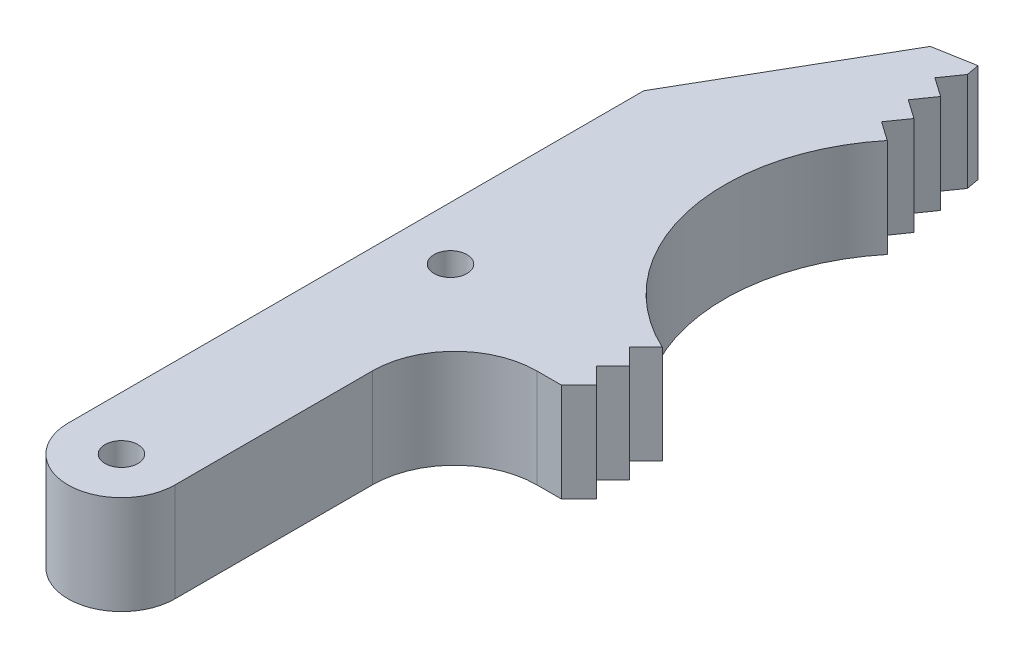
ISO-10303-21;
HEADER;
FILE_DESCRIPTION(('STEP AP214'),'2;1');
FILE_NAME('part.step','',(''),(''),'','','');
FILE_SCHEMA(('AUTOMOTIVE_DESIGN { 1 0 10303 214 1 1 1 1 }'));
ENDSEC;
DATA;
#1=APPLICATION_CONTEXT('core data for automotive mechanical design processes');
#2=APPLICATION_PROTOCOL_DEFINITION('international standard','automotive_design',2000,#1);
#3=PRODUCT_CONTEXT('',#1,'mechanical');
#4=PRODUCT('Part','Part','',(#3));
#5=PRODUCT_RELATED_PRODUCT_CATEGORY('part','',(#4));
#6=PRODUCT_DEFINITION_FORMATION('','',#4);
#7=PRODUCT_DEFINITION_CONTEXT('part definition',#1,'design');
#8=PRODUCT_DEFINITION('design','',#6,#7);
#9=PRODUCT_DEFINITION_SHAPE('','',#8);
#10=(LENGTH_UNIT() NAMED_UNIT(*) SI_UNIT(.MILLI.,.METRE.));
#11=(NAMED_UNIT(*) PLANE_ANGLE_UNIT() SI_UNIT($,.RADIAN.));
#12=(NAMED_UNIT(*) SI_UNIT($,.STERADIAN.) SOLID_ANGLE_UNIT());
#13=UNCERTAINTY_MEASURE_WITH_UNIT(LENGTH_MEASURE(1.E-05),#10,'distance_accuracy_value','');
#14=(GEOMETRIC_REPRESENTATION_CONTEXT(3) GLOBAL_UNCERTAINTY_ASSIGNED_CONTEXT((#13)) GLOBAL_UNIT_ASSIGNED_CONTEXT((#10,
#11,#12)) REPRESENTATION_CONTEXT('',''));
#15=CARTESIAN_POINT('',(0.,0.,0.));
#16=DIRECTION('',(0.,0.,1.));
#17=DIRECTION('',(1.,0.,0.));
#18=AXIS2_PLACEMENT_3D('',#15,#16,#17);
#19=CARTESIAN_POINT('',(0.,12.,0.));
#20=DIRECTION('',(0.,1.,0.));
#21=DIRECTION('',(0.,0.,1.));
#22=AXIS2_PLACEMENT_3D('',#19,#20,#21);
#23=PLANE('',#22);
#24=CARTESIAN_POINT('',(0.,12.,-40.));
#25=DIRECTION('',(0.,1.,0.));
#26=DIRECTION('',(0.,0.,1.));
#27=AXIS2_PLACEMENT_3D('',#24,#25,#26);
#28=CIRCLE('',#27,2.);
#29=CARTESIAN_POINT('',(0.,12.,-38.));
#30=VERTEX_POINT('',#29);
#31=EDGE_CURVE('E380',#30,#30,#28,.T.);
#32=ORIENTED_EDGE('',*,*,#31,.F.);
#33=EDGE_LOOP('',(#32));
#34=FACE_BOUND('',#33,.T.);
#35=DIRECTION('',(-0.500000000000001,0.,0.866025403784438));
#36=VECTOR('',#35,1.);
#37=CARTESIAN_POINT('',(6.25000000000002,12.,-92.0836477965032));
#38=LINE('',#37,#36);
#39=CARTESIAN_POINT('',(6.25000000000002,12.,-92.0836477965032));
#40=VERTEX_POINT('',#39);
#41=CARTESIAN_POINT('',(-6.50000000000001,12.,-70.));
#42=VERTEX_POINT('',#41);
#43=EDGE_CURVE('E241',#40,#42,#38,.T.);
#44=ORIENTED_EDGE('',*,*,#43,.T.);
#45=DIRECTION('',(0.,0.,1.));
#46=VECTOR('',#45,1.);
#47=CARTESIAN_POINT('',(-6.50000000000001,12.,-70.));
#48=LINE('',#47,#46);
#49=CARTESIAN_POINT('',(-6.50000000000001,12.,0.));
#50=VERTEX_POINT('',#49);
#51=EDGE_CURVE('E129',#42,#50,#48,.T.);
#52=ORIENTED_EDGE('',*,*,#51,.T.);
#53=CARTESIAN_POINT('',(0.,12.,0.));
#54=DIRECTION('',(0.,1.,0.));
#55=DIRECTION('',(0.,0.,1.));
#56=AXIS2_PLACEMENT_3D('',#53,#54,#55);
#57=CIRCLE('',#56,6.50000000000001);
#58=CARTESIAN_POINT('',(6.50000000000001,12.,0.));
#59=VERTEX_POINT('',#58);
#60=EDGE_CURVE('E292',#50,#59,#57,.T.);
#61=ORIENTED_EDGE('',*,*,#60,.T.);
#62=DIRECTION('',(0.,0.,-1.));
#63=VECTOR('',#62,1.);
#64=CARTESIAN_POINT('',(6.50000000000001,12.,0.));
#65=LINE('',#64,#63);
#66=CARTESIAN_POINT('',(6.50000000000001,12.,-24.));
#67=VERTEX_POINT('',#66);
#68=EDGE_CURVE('E311',#59,#67,#65,.T.);
#69=ORIENTED_EDGE('',*,*,#68,.T.);
#70=CARTESIAN_POINT('',(16.5,12.,-24.));
#71=DIRECTION('',(0.,-1.,0.));
#72=DIRECTION('',(0.,0.,1.));
#73=AXIS2_PLACEMENT_3D('',#70,#71,#72);
#74=CIRCLE('',#73,10.);
#75=CARTESIAN_POINT('',(16.5,12.,-34.));
#76=VERTEX_POINT('',#75);
#77=EDGE_CURVE('E308',#67,#76,#74,.T.);
#78=ORIENTED_EDGE('',*,*,#77,.T.);
#79=DIRECTION('',(1.,0.,0.));
#80=VECTOR('',#79,1.);
#81=CARTESIAN_POINT('',(16.5,12.,-34.));
#82=LINE('',#81,#80);
#83=CARTESIAN_POINT('',(19.5,12.,-34.));
#84=VERTEX_POINT('',#83);
#85=EDGE_CURVE('E310',#76,#84,#82,.T.);
#86=ORIENTED_EDGE('',*,*,#85,.T.);
#87=DIRECTION('',(0.707106781186576,0.,-0.707106781186519));
#88=VECTOR('',#87,1.);
#89=CARTESIAN_POINT('',(19.5,12.,-34.));
#90=LINE('',#89,#88);
#91=CARTESIAN_POINT('',(21.6213203435597,12.,-36.1213203435596));
#92=VERTEX_POINT('',#91);
#93=EDGE_CURVE('E313',#84,#92,#90,.T.);
#94=ORIENTED_EDGE('',*,*,#93,.T.);
#95=DIRECTION('',(-0.707106781186549,0.,-0.707106781186546));
#96=VECTOR('',#95,1.);
#97=CARTESIAN_POINT('',(21.6213203435597,12.,-36.1213203435596));
#98=LINE('',#97,#96);
#99=CARTESIAN_POINT('',(19.6213203435597,12.,-38.1213203435595));
#100=VERTEX_POINT('',#99);
#101=EDGE_CURVE('E319',#92,#100,#98,.T.);
#102=ORIENTED_EDGE('',*,*,#101,.T.);
#103=DIRECTION('',(0.707106781186548,0.,-0.707106781186547));
#104=VECTOR('',#103,1.);
#105=CARTESIAN_POINT('',(19.6213203435597,12.,-38.1213203435595));
#106=LINE('',#105,#104);
#107=CARTESIAN_POINT('',(21.6213203435597,12.,-40.1213203435595));
#108=VERTEX_POINT('',#107);
#109=EDGE_CURVE('E321',#100,#108,#106,.T.);
#110=ORIENTED_EDGE('',*,*,#109,.T.);
#111=DIRECTION('',(-0.707106781186548,0.,-0.707106781186547));
#112=VECTOR('',#111,1.);
#113=CARTESIAN_POINT('',(21.6213203435597,12.,-40.1213203435595));
#114=LINE('',#113,#112);
#115=CARTESIAN_POINT('',(19.6213203435597,12.,-42.1213203435595));
#116=VERTEX_POINT('',#115);
#117=EDGE_CURVE('E323',#108,#116,#114,.T.);
#118=ORIENTED_EDGE('',*,*,#117,.T.);
#119=DIRECTION('',(0.707106781186546,0.,-0.707106781186549));
#120=VECTOR('',#119,1.);
#121=CARTESIAN_POINT('',(19.6213203435597,12.,-42.1213203435595));
#122=LINE('',#121,#120);
#123=CARTESIAN_POINT('',(21.6213203435597,12.,-44.1213203435595));
#124=VERTEX_POINT('',#123);
#125=EDGE_CURVE('E325',#116,#124,#122,.T.);
#126=ORIENTED_EDGE('',*,*,#125,.T.);
#127=CARTESIAN_POINT('',(31.3216319671078,12.,-64.9756713141856));
#128=DIRECTION('',(0.,-1.,0.));
#129=DIRECTION('',(0.,0.,1.));
#130=AXIS2_PLACEMENT_3D('',#127,#128,#129);
#131=CIRCLE('',#130,22.9999999999999);
#132=CARTESIAN_POINT('',(13.5356539813313,12.,-79.5585032438718));
#133=VERTEX_POINT('',#132);
#134=EDGE_CURVE('E327',#124,#133,#131,.T.);
#135=ORIENTED_EDGE('',*,*,#134,.T.);
#136=DIRECTION('',(-0.819152044289008,0.,-0.573576436351023));
#137=VECTOR('',#136,1.);
#138=CARTESIAN_POINT('',(13.5356539813313,12.,-79.5585032438719));
#139=LINE('',#138,#137);
#140=CARTESIAN_POINT('',(11.2187421199729,12.,-81.1808223945624));
#141=VERTEX_POINT('',#140);
#142=EDGE_CURVE('E329',#133,#141,#139,.T.);
#143=ORIENTED_EDGE('',*,*,#142,.T.);
#144=DIRECTION('',(0.573576436351062,0.,-0.819152044288981));
#145=VECTOR('',#144,1.);
#146=CARTESIAN_POINT('',(11.2187421199729,12.,-81.1808223945624));
#147=LINE('',#146,#145);
#148=CARTESIAN_POINT('',(12.8410612706636,12.,-83.4977342559207));
#149=VERTEX_POINT('',#148);
#150=EDGE_CURVE('E331',#141,#149,#147,.T.);
#151=ORIENTED_EDGE('',*,*,#150,.T.);
#152=DIRECTION('',(-0.819152044288988,0.,-0.573576436351051));
#153=VECTOR('',#152,1.);
#154=CARTESIAN_POINT('',(12.8410612706636,12.,-83.4977342559207));
#155=LINE('',#154,#153);
#156=CARTESIAN_POINT('',(10.5241494093054,12.,-85.1200534066112));
#157=VERTEX_POINT('',#156);
#158=EDGE_CURVE('E333',#149,#157,#155,.T.);
#159=ORIENTED_EDGE('',*,*,#158,.T.);
#160=DIRECTION('',(0.573576436351038,0.,-0.819152044288997));
#161=VECTOR('',#160,1.);
#162=CARTESIAN_POINT('',(10.5241494093054,12.,-85.1200534066112));
#163=LINE('',#162,#161);
#164=CARTESIAN_POINT('',(12.1464685599959,12.,-87.4369652679695));
#165=VERTEX_POINT('',#164);
#166=EDGE_CURVE('E335',#157,#165,#163,.T.);
#167=ORIENTED_EDGE('',*,*,#166,.T.);
#168=DIRECTION('',(-0.819152044288996,0.,-0.57357643635104));
#169=VECTOR('',#168,1.);
#170=CARTESIAN_POINT('',(12.1464685599959,12.,-87.4369652679695));
#171=LINE('',#170,#169);
#172=CARTESIAN_POINT('',(9.82955669863762,12.,-89.05928441866));
#173=VERTEX_POINT('',#172);
#174=EDGE_CURVE('E184',#165,#173,#171,.T.);
#175=ORIENTED_EDGE('',*,*,#174,.T.);
#176=DIRECTION('',(0.573576436351043,0.,-0.819152044288994));
#177=VECTOR('',#176,1.);
#178=CARTESIAN_POINT('',(9.82955669863762,12.,-89.05928441866));
#179=LINE('',#178,#177);
#180=CARTESIAN_POINT('',(11.4518758493282,12.,-91.3761962800183));
#181=VERTEX_POINT('',#180);
#182=EDGE_CURVE('E178',#173,#181,#179,.T.);
#183=ORIENTED_EDGE('',*,*,#182,.T.);
#184=DIRECTION('',(-0.173648177666936,0.,-0.984807753012207));
#185=VECTOR('',#184,1.);
#186=CARTESIAN_POINT('',(11.4518758493282,12.,-91.3761962800183));
#187=LINE('',#186,#185);
#188=CARTESIAN_POINT('',(11.1740387650611,12.,-92.9518886848378));
#189=VERTEX_POINT('',#188);
#190=EDGE_CURVE('E182',#181,#189,#187,.T.);
#191=ORIENTED_EDGE('',*,*,#190,.T.);
#192=DIRECTION('',(-0.984807753012208,0.,0.173648177666932));
#193=VECTOR('',#192,1.);
#194=CARTESIAN_POINT('',(11.1740387650611,12.,-92.9518886848378));
#195=LINE('',#194,#193);
#196=EDGE_CURVE('E50',#189,#40,#195,.T.);
#197=ORIENTED_EDGE('',*,*,#196,.T.);
#198=EDGE_LOOP('',(#44,#52,#61,#69,#78,#86,#94,#102,#110,#118,#126,#135,#143,#151,#159,#167,
#175,#183,#191,#197));
#199=FACE_BOUND('',#198,.T.);
#200=CARTESIAN_POINT('',(0.,12.,0.));
#201=DIRECTION('',(0.,1.,0.));
#202=DIRECTION('',(0.,0.,1.));
#203=AXIS2_PLACEMENT_3D('',#200,#201,#202);
#204=CIRCLE('',#203,2.);
#205=CARTESIAN_POINT('',(0.,12.,2.));
#206=VERTEX_POINT('',#205);
#207=EDGE_CURVE('E206',#206,#206,#204,.T.);
#208=ORIENTED_EDGE('',*,*,#207,.F.);
#209=EDGE_LOOP('',(#208));
#210=FACE_BOUND('',#209,.T.);
#211=ADVANCED_FACE('F33',(#34,#199,#210),#23,.T.);
#212=CARTESIAN_POINT('',(0.,0.,0.));
#213=DIRECTION('',(0.,1.,0.));
#214=DIRECTION('',(0.,0.,1.));
#215=AXIS2_PLACEMENT_3D('',#212,#213,#214);
#216=PLANE('',#215);
#217=CARTESIAN_POINT('',(0.,0.,-40.));
#218=DIRECTION('',(0.,1.,0.));
#219=DIRECTION('',(0.,0.,1.));
#220=AXIS2_PLACEMENT_3D('',#217,#218,#219);
#221=CIRCLE('',#220,2.);
#222=CARTESIAN_POINT('',(0.,0.,-38.));
#223=VERTEX_POINT('',#222);
#224=EDGE_CURVE('E378',#223,#223,#221,.T.);
#225=ORIENTED_EDGE('',*,*,#224,.T.);
#226=EDGE_LOOP('',(#225));
#227=FACE_BOUND('',#226,.T.);
#228=DIRECTION('',(-0.500000000000001,0.,0.866025403784438));
#229=VECTOR('',#228,1.);
#230=CARTESIAN_POINT('',(6.25000000000002,0.,-92.0836477965032));
#231=LINE('',#230,#229);
#232=CARTESIAN_POINT('',(6.25000000000002,0.,-92.0836477965032));
#233=VERTEX_POINT('',#232);
#234=CARTESIAN_POINT('',(-6.50000000000001,0.,-70.));
#235=VERTEX_POINT('',#234);
#236=EDGE_CURVE('E202',#233,#235,#231,.T.);
#237=ORIENTED_EDGE('',*,*,#236,.F.);
#238=DIRECTION('',(-0.984807753012208,0.,0.173648177666932));
#239=VECTOR('',#238,1.);
#240=CARTESIAN_POINT('',(11.1740387650611,0.,-92.9518886848378));
#241=LINE('',#240,#239);
#242=CARTESIAN_POINT('',(11.1740387650611,0.,-92.9518886848378));
#243=VERTEX_POINT('',#242);
#244=EDGE_CURVE('E121',#243,#233,#241,.T.);
#245=ORIENTED_EDGE('',*,*,#244,.F.);
#246=DIRECTION('',(-0.173648177666936,0.,-0.984807753012207));
#247=VECTOR('',#246,1.);
#248=CARTESIAN_POINT('',(11.4518758493282,0.,-91.3761962800183));
#249=LINE('',#248,#247);
#250=CARTESIAN_POINT('',(11.4518758493282,0.,-91.3761962800183));
#251=VERTEX_POINT('',#250);
#252=EDGE_CURVE('E115',#251,#243,#249,.T.);
#253=ORIENTED_EDGE('',*,*,#252,.F.);
#254=DIRECTION('',(0.573576436351043,0.,-0.819152044288994));
#255=VECTOR('',#254,1.);
#256=CARTESIAN_POINT('',(9.82955669863762,0.,-89.05928441866));
#257=LINE('',#256,#255);
#258=CARTESIAN_POINT('',(9.82955669863762,0.,-89.05928441866));
#259=VERTEX_POINT('',#258);
#260=EDGE_CURVE('E192',#259,#251,#257,.T.);
#261=ORIENTED_EDGE('',*,*,#260,.F.);
#262=DIRECTION('',(-0.819152044288996,0.,-0.57357643635104));
#263=VECTOR('',#262,1.);
#264=CARTESIAN_POINT('',(12.1464685599959,0.,-87.4369652679695));
#265=LINE('',#264,#263);
#266=CARTESIAN_POINT('',(12.1464685599959,0.,-87.4369652679695));
#267=VERTEX_POINT('',#266);
#268=EDGE_CURVE('E236',#267,#259,#265,.T.);
#269=ORIENTED_EDGE('',*,*,#268,.F.);
#270=DIRECTION('',(0.573576436351038,0.,-0.819152044288997));
#271=VECTOR('',#270,1.);
#272=CARTESIAN_POINT('',(10.5241494093054,0.,-85.1200534066112));
#273=LINE('',#272,#271);
#274=CARTESIAN_POINT('',(10.5241494093054,0.,-85.1200534066112));
#275=VERTEX_POINT('',#274);
#276=EDGE_CURVE('E234',#275,#267,#273,.T.);
#277=ORIENTED_EDGE('',*,*,#276,.F.);
#278=DIRECTION('',(-0.819152044288988,0.,-0.573576436351051));
#279=VECTOR('',#278,1.);
#280=CARTESIAN_POINT('',(12.8410612706636,0.,-83.4977342559207));
#281=LINE('',#280,#279);
#282=CARTESIAN_POINT('',(12.8410612706636,0.,-83.4977342559207));
#283=VERTEX_POINT('',#282);
#284=EDGE_CURVE('E232',#283,#275,#281,.T.);
#285=ORIENTED_EDGE('',*,*,#284,.F.);
#286=DIRECTION('',(0.573576436351062,0.,-0.819152044288981));
#287=VECTOR('',#286,1.);
#288=CARTESIAN_POINT('',(11.2187421199729,0.,-81.1808223945624));
#289=LINE('',#288,#287);
#290=CARTESIAN_POINT('',(11.2187421199729,0.,-81.1808223945624));
#291=VERTEX_POINT('',#290);
#292=EDGE_CURVE('E230',#291,#283,#289,.T.);
#293=ORIENTED_EDGE('',*,*,#292,.F.);
#294=DIRECTION('',(-0.819152044289008,0.,-0.573576436351023));
#295=VECTOR('',#294,1.);
#296=CARTESIAN_POINT('',(13.5356539813313,0.,-79.5585032438719));
#297=LINE('',#296,#295);
#298=CARTESIAN_POINT('',(13.5356539813313,0.,-79.5585032438718));
#299=VERTEX_POINT('',#298);
#300=EDGE_CURVE('E228',#299,#291,#297,.T.);
#301=ORIENTED_EDGE('',*,*,#300,.F.);
#302=CARTESIAN_POINT('',(31.3216319671078,0.,-64.9756713141856));
#303=DIRECTION('',(0.,-1.,0.));
#304=DIRECTION('',(0.,0.,1.));
#305=AXIS2_PLACEMENT_3D('',#302,#303,#304);
#306=CIRCLE('',#305,22.9999999999999);
#307=CARTESIAN_POINT('',(21.6213203435597,0.,-44.1213203435595));
#308=VERTEX_POINT('',#307);
#309=EDGE_CURVE('E226',#308,#299,#306,.T.);
#310=ORIENTED_EDGE('',*,*,#309,.F.);
#311=DIRECTION('',(0.707106781186546,0.,-0.707106781186549));
#312=VECTOR('',#311,1.);
#313=CARTESIAN_POINT('',(19.6213203435597,0.,-42.1213203435595));
#314=LINE('',#313,#312);
#315=CARTESIAN_POINT('',(19.6213203435597,0.,-42.1213203435595));
#316=VERTEX_POINT('',#315);
#317=EDGE_CURVE('E224',#316,#308,#314,.T.);
#318=ORIENTED_EDGE('',*,*,#317,.F.);
#319=DIRECTION('',(-0.707106781186548,0.,-0.707106781186547));
#320=VECTOR('',#319,1.);
#321=CARTESIAN_POINT('',(21.6213203435597,0.,-40.1213203435595));
#322=LINE('',#321,#320);
#323=CARTESIAN_POINT('',(21.6213203435597,0.,-40.1213203435595));
#324=VERTEX_POINT('',#323);
#325=EDGE_CURVE('E222',#324,#316,#322,.T.);
#326=ORIENTED_EDGE('',*,*,#325,.F.);
#327=DIRECTION('',(0.707106781186548,0.,-0.707106781186547));
#328=VECTOR('',#327,1.);
#329=CARTESIAN_POINT('',(19.6213203435597,0.,-38.1213203435595));
#330=LINE('',#329,#328);
#331=CARTESIAN_POINT('',(19.6213203435597,0.,-38.1213203435595));
#332=VERTEX_POINT('',#331);
#333=EDGE_CURVE('E220',#332,#324,#330,.T.);
#334=ORIENTED_EDGE('',*,*,#333,.F.);
#335=DIRECTION('',(-0.707106781186549,0.,-0.707106781186546));
#336=VECTOR('',#335,1.);
#337=CARTESIAN_POINT('',(21.6213203435597,0.,-36.1213203435596));
#338=LINE('',#337,#336);
#339=CARTESIAN_POINT('',(21.6213203435597,0.,-36.1213203435596));
#340=VERTEX_POINT('',#339);
#341=EDGE_CURVE('E218',#340,#332,#338,.T.);
#342=ORIENTED_EDGE('',*,*,#341,.F.);
#343=DIRECTION('',(0.707106781186576,0.,-0.707106781186519));
#344=VECTOR('',#343,1.);
#345=CARTESIAN_POINT('',(19.5,0.,-34.));
#346=LINE('',#345,#344);
#347=CARTESIAN_POINT('',(19.5,0.,-34.));
#348=VERTEX_POINT('',#347);
#349=EDGE_CURVE('E216',#348,#340,#346,.T.);
#350=ORIENTED_EDGE('',*,*,#349,.F.);
#351=DIRECTION('',(1.,0.,0.));
#352=VECTOR('',#351,1.);
#353=CARTESIAN_POINT('',(16.5,0.,-34.));
#354=LINE('',#353,#352);
#355=CARTESIAN_POINT('',(16.5,0.,-34.));
#356=VERTEX_POINT('',#355);
#357=EDGE_CURVE('E214',#356,#348,#354,.T.);
#358=ORIENTED_EDGE('',*,*,#357,.F.);
#359=CARTESIAN_POINT('',(16.5,0.,-24.));
#360=DIRECTION('',(0.,-1.,0.));
#361=DIRECTION('',(0.,0.,1.));
#362=AXIS2_PLACEMENT_3D('',#359,#360,#361);
#363=CIRCLE('',#362,10.);
#364=CARTESIAN_POINT('',(6.50000000000001,0.,-24.));
#365=VERTEX_POINT('',#364);
#366=EDGE_CURVE('E212',#365,#356,#363,.T.);
#367=ORIENTED_EDGE('',*,*,#366,.F.);
#368=DIRECTION('',(0.,0.,-1.));
#369=VECTOR('',#368,1.);
#370=CARTESIAN_POINT('',(6.50000000000001,0.,0.));
#371=LINE('',#370,#369);
#372=CARTESIAN_POINT('',(6.50000000000001,0.,0.));
#373=VERTEX_POINT('',#372);
#374=EDGE_CURVE('E210',#373,#365,#371,.T.);
#375=ORIENTED_EDGE('',*,*,#374,.F.);
#376=CARTESIAN_POINT('',(0.,0.,0.));
#377=DIRECTION('',(0.,1.,0.));
#378=DIRECTION('',(0.,0.,1.));
#379=AXIS2_PLACEMENT_3D('',#376,#377,#378);
#380=CIRCLE('',#379,6.50000000000001);
#381=CARTESIAN_POINT('',(-6.50000000000001,0.,0.));
#382=VERTEX_POINT('',#381);
#383=EDGE_CURVE('E208',#382,#373,#380,.T.);
#384=ORIENTED_EDGE('',*,*,#383,.F.);
#385=DIRECTION('',(0.,0.,1.));
#386=VECTOR('',#385,1.);
#387=CARTESIAN_POINT('',(-6.50000000000001,0.,-70.));
#388=LINE('',#387,#386);
#389=EDGE_CURVE('E205',#235,#382,#388,.T.);
#390=ORIENTED_EDGE('',*,*,#389,.F.);
#391=EDGE_LOOP('',(#237,#245,#253,#261,#269,#277,#285,#293,#301,#310,#318,#326,#334,#342,#350,
#358,#367,#375,#384,#390));
#392=FACE_BOUND('',#391,.T.);
#393=CARTESIAN_POINT('',(0.,0.,0.));
#394=DIRECTION('',(0.,1.,0.));
#395=DIRECTION('',(0.,0.,1.));
#396=AXIS2_PLACEMENT_3D('',#393,#394,#395);
#397=CIRCLE('',#396,2.);
#398=CARTESIAN_POINT('',(0.,0.,2.));
#399=VERTEX_POINT('',#398);
#400=EDGE_CURVE('E382',#399,#399,#397,.T.);
#401=ORIENTED_EDGE('',*,*,#400,.T.);
#402=EDGE_LOOP('',(#401));
#403=FACE_BOUND('',#402,.T.);
#404=ADVANCED_FACE('F296',(#227,#392,#403),#216,.F.);
#405=CARTESIAN_POINT('',(6.25000000000002,12.,-92.0836477965032));
#406=DIRECTION('',(0.866025403784438,0.,0.500000000000001));
#407=DIRECTION('',(0.500000000000001,0.,-0.866025403784438));
#408=AXIS2_PLACEMENT_3D('',#405,#406,#407);
#409=PLANE('',#408);
#410=ORIENTED_EDGE('',*,*,#236,.T.);
#411=DIRECTION('',(0.,-1.,0.));
#412=VECTOR('',#411,1.);
#413=CARTESIAN_POINT('',(-6.50000000000001,12.,-70.));
#414=LINE('',#413,#412);
#415=EDGE_CURVE('E11',#42,#235,#414,.T.);
#416=ORIENTED_EDGE('',*,*,#415,.F.);
#417=ORIENTED_EDGE('',*,*,#43,.F.);
#418=DIRECTION('',(0.,-1.,0.));
#419=VECTOR('',#418,1.);
#420=CARTESIAN_POINT('',(6.25000000000002,12.,-92.0836477965032));
#421=LINE('',#420,#419);
#422=EDGE_CURVE('E198',#40,#233,#421,.T.);
#423=ORIENTED_EDGE('',*,*,#422,.T.);
#424=EDGE_LOOP('',(#410,#416,#417,#423));
#425=FACE_BOUND('',#424,.T.);
#426=ADVANCED_FACE('F35',(#425),#409,.F.);
#427=CARTESIAN_POINT('',(-6.50000000000001,12.,-70.));
#428=DIRECTION('',(1.,0.,0.));
#429=DIRECTION('',(0.,0.,-1.));
#430=AXIS2_PLACEMENT_3D('',#427,#428,#429);
#431=PLANE('',#430);
#432=ORIENTED_EDGE('',*,*,#389,.T.);
#433=DIRECTION('',(0.,-1.,0.));
#434=VECTOR('',#433,1.);
#435=CARTESIAN_POINT('',(-6.50000000000001,12.,0.));
#436=LINE('',#435,#434);
#437=EDGE_CURVE('E42',#50,#382,#436,.T.);
#438=ORIENTED_EDGE('',*,*,#437,.F.);
#439=ORIENTED_EDGE('',*,*,#51,.F.);
#440=ORIENTED_EDGE('',*,*,#415,.T.);
#441=EDGE_LOOP('',(#432,#438,#439,#440));
#442=FACE_BOUND('',#441,.T.);
#443=ADVANCED_FACE('F419',(#442),#431,.F.);
#444=CARTESIAN_POINT('',(0.,12.,0.));
#445=DIRECTION('',(0.,-1.,0.));
#446=DIRECTION('',(0.,0.,-1.));
#447=AXIS2_PLACEMENT_3D('',#444,#445,#446);
#448=CYLINDRICAL_SURFACE('',#447,6.50000000000001);
#449=ORIENTED_EDGE('',*,*,#383,.T.);
#450=DIRECTION('',(0.,-1.,0.));
#451=VECTOR('',#450,1.);
#452=CARTESIAN_POINT('',(6.50000000000001,12.,0.));
#453=LINE('',#452,#451);
#454=EDGE_CURVE('E284',#59,#373,#453,.T.);
#455=ORIENTED_EDGE('',*,*,#454,.F.);
#456=ORIENTED_EDGE('',*,*,#60,.F.);
#457=ORIENTED_EDGE('',*,*,#437,.T.);
#458=EDGE_LOOP('',(#449,#455,#456,#457));
#459=FACE_BOUND('',#458,.T.);
#460=ADVANCED_FACE('F290',(#459),#448,.T.);
#461=CARTESIAN_POINT('',(6.50000000000001,12.,0.));
#462=DIRECTION('',(-1.,0.,0.));
#463=DIRECTION('',(0.,0.,1.));
#464=AXIS2_PLACEMENT_3D('',#461,#462,#463);
#465=PLANE('',#464);
#466=ORIENTED_EDGE('',*,*,#374,.T.);
#467=DIRECTION('',(0.,-1.,0.));
#468=VECTOR('',#467,1.);
#469=CARTESIAN_POINT('',(6.50000000000001,12.,-24.));
#470=LINE('',#469,#468);
#471=EDGE_CURVE('E281',#67,#365,#470,.T.);
#472=ORIENTED_EDGE('',*,*,#471,.F.);
#473=ORIENTED_EDGE('',*,*,#68,.F.);
#474=ORIENTED_EDGE('',*,*,#454,.T.);
#475=EDGE_LOOP('',(#466,#472,#473,#474));
#476=FACE_BOUND('',#475,.T.);
#477=ADVANCED_FACE('F302',(#476),#465,.F.);
#478=CARTESIAN_POINT('',(16.5,12.,-24.));
#479=DIRECTION('',(0.,-1.,0.));
#480=DIRECTION('',(0.,0.,-1.));
#481=AXIS2_PLACEMENT_3D('',#478,#479,#480);
#482=CYLINDRICAL_SURFACE('',#481,10.);
#483=ORIENTED_EDGE('',*,*,#366,.T.);
#484=DIRECTION('',(0.,-1.,0.));
#485=VECTOR('',#484,1.);
#486=CARTESIAN_POINT('',(16.5,12.,-34.));
#487=LINE('',#486,#485);
#488=EDGE_CURVE('E278',#76,#356,#487,.T.);
#489=ORIENTED_EDGE('',*,*,#488,.F.);
#490=ORIENTED_EDGE('',*,*,#77,.F.);
#491=ORIENTED_EDGE('',*,*,#471,.T.);
#492=EDGE_LOOP('',(#483,#489,#490,#491));
#493=FACE_BOUND('',#492,.T.);
#494=ADVANCED_FACE('F306',(#493),#482,.F.);
#495=CARTESIAN_POINT('',(16.5,12.,-34.));
#496=DIRECTION('',(0.,0.,-1.));
#497=DIRECTION('',(-1.,0.,0.));
#498=AXIS2_PLACEMENT_3D('',#495,#496,#497);
#499=PLANE('',#498);
#500=ORIENTED_EDGE('',*,*,#357,.T.);
#501=DIRECTION('',(0.,-1.,0.));
#502=VECTOR('',#501,1.);
#503=CARTESIAN_POINT('',(19.5,12.,-34.));
#504=LINE('',#503,#502);
#505=EDGE_CURVE('E275',#84,#348,#504,.T.);
#506=ORIENTED_EDGE('',*,*,#505,.F.);
#507=ORIENTED_EDGE('',*,*,#85,.F.);
#508=ORIENTED_EDGE('',*,*,#488,.T.);
#509=EDGE_LOOP('',(#500,#506,#507,#508));
#510=FACE_BOUND('',#509,.T.);
#511=ADVANCED_FACE('F441',(#510),#499,.F.);
#512=CARTESIAN_POINT('',(19.5,12.,-34.));
#513=DIRECTION('',(-0.707106781186519,0.,-0.707106781186576));
#514=DIRECTION('',(-0.707106781186576,0.,0.707106781186519));
#515=AXIS2_PLACEMENT_3D('',#512,#513,#514);
#516=PLANE('',#515);
#517=ORIENTED_EDGE('',*,*,#349,.T.);
#518=DIRECTION('',(0.,-1.,0.));
#519=VECTOR('',#518,1.);
#520=CARTESIAN_POINT('',(21.6213203435597,12.,-36.1213203435596));
#521=LINE('',#520,#519);
#522=EDGE_CURVE('E272',#92,#340,#521,.T.);
#523=ORIENTED_EDGE('',*,*,#522,.F.);
#524=ORIENTED_EDGE('',*,*,#93,.F.);
#525=ORIENTED_EDGE('',*,*,#505,.T.);
#526=EDGE_LOOP('',(#517,#523,#524,#525));
#527=FACE_BOUND('',#526,.T.);
#528=ADVANCED_FACE('F448',(#527),#516,.F.);
#529=CARTESIAN_POINT('',(21.6213203435597,12.,-36.1213203435596));
#530=DIRECTION('',(-0.707106781186546,0.,0.707106781186549));
#531=DIRECTION('',(0.707106781186549,0.,0.707106781186546));
#532=AXIS2_PLACEMENT_3D('',#529,#530,#531);
#533=PLANE('',#532);
#534=ORIENTED_EDGE('',*,*,#341,.T.);
#535=DIRECTION('',(0.,-1.,0.));
#536=VECTOR('',#535,1.);
#537=CARTESIAN_POINT('',(19.6213203435597,12.,-38.1213203435595));
#538=LINE('',#537,#536);
#539=EDGE_CURVE('E269',#100,#332,#538,.T.);
#540=ORIENTED_EDGE('',*,*,#539,.F.);
#541=ORIENTED_EDGE('',*,*,#101,.F.);
#542=ORIENTED_EDGE('',*,*,#522,.T.);
#543=EDGE_LOOP('',(#534,#540,#541,#542));
#544=FACE_BOUND('',#543,.T.);
#545=ADVANCED_FACE('F456',(#544),#533,.F.);
#546=CARTESIAN_POINT('',(19.6213203435597,12.,-38.1213203435595));
#547=DIRECTION('',(-0.707106781186547,0.,-0.707106781186548));
#548=DIRECTION('',(-0.707106781186548,0.,0.707106781186547));
#549=AXIS2_PLACEMENT_3D('',#546,#547,#548);
#550=PLANE('',#549);
#551=ORIENTED_EDGE('',*,*,#333,.T.);
#552=DIRECTION('',(0.,-1.,0.));
#553=VECTOR('',#552,1.);
#554=CARTESIAN_POINT('',(21.6213203435597,12.,-40.1213203435595));
#555=LINE('',#554,#553);
#556=EDGE_CURVE('E266',#108,#324,#555,.T.);
#557=ORIENTED_EDGE('',*,*,#556,.F.);
#558=ORIENTED_EDGE('',*,*,#109,.F.);
#559=ORIENTED_EDGE('',*,*,#539,.T.);
#560=EDGE_LOOP('',(#551,#557,#558,#559));
#561=FACE_BOUND('',#560,.T.);
#562=ADVANCED_FACE('F464',(#561),#550,.F.);
#563=CARTESIAN_POINT('',(21.6213203435597,12.,-40.1213203435595));
#564=DIRECTION('',(-0.707106781186547,0.,0.707106781186548));
#565=DIRECTION('',(0.707106781186548,0.,0.707106781186547));
#566=AXIS2_PLACEMENT_3D('',#563,#564,#565);
#567=PLANE('',#566);
#568=ORIENTED_EDGE('',*,*,#325,.T.);
#569=DIRECTION('',(0.,-1.,0.));
#570=VECTOR('',#569,1.);
#571=CARTESIAN_POINT('',(19.6213203435597,12.,-42.1213203435595));
#572=LINE('',#571,#570);
#573=EDGE_CURVE('E263',#116,#316,#572,.T.);
#574=ORIENTED_EDGE('',*,*,#573,.F.);
#575=ORIENTED_EDGE('',*,*,#117,.F.);
#576=ORIENTED_EDGE('',*,*,#556,.T.);
#577=EDGE_LOOP('',(#568,#574,#575,#576));
#578=FACE_BOUND('',#577,.T.);
#579=ADVANCED_FACE('F472',(#578),#567,.F.);
#580=CARTESIAN_POINT('',(19.6213203435597,12.,-42.1213203435595));
#581=DIRECTION('',(-0.707106781186549,0.,-0.707106781186546));
#582=DIRECTION('',(-0.707106781186546,0.,0.707106781186549));
#583=AXIS2_PLACEMENT_3D('',#580,#581,#582);
#584=PLANE('',#583);
#585=ORIENTED_EDGE('',*,*,#317,.T.);
#586=DIRECTION('',(0.,-1.,0.));
#587=VECTOR('',#586,1.);
#588=CARTESIAN_POINT('',(21.6213203435597,12.,-44.1213203435595));
#589=LINE('',#588,#587);
#590=EDGE_CURVE('E260',#124,#308,#589,.T.);
#591=ORIENTED_EDGE('',*,*,#590,.F.);
#592=ORIENTED_EDGE('',*,*,#125,.F.);
#593=ORIENTED_EDGE('',*,*,#573,.T.);
#594=EDGE_LOOP('',(#585,#591,#592,#593));
#595=FACE_BOUND('',#594,.T.);
#596=ADVANCED_FACE('F480',(#595),#584,.F.);
#597=CARTESIAN_POINT('',(31.3216319671078,12.,-64.9756713141856));
#598=DIRECTION('',(0.,-1.,0.));
#599=DIRECTION('',(0.,0.,-1.));
#600=AXIS2_PLACEMENT_3D('',#597,#598,#599);
#601=CYLINDRICAL_SURFACE('',#600,22.9999999999999);
#602=ORIENTED_EDGE('',*,*,#309,.T.);
#603=DIRECTION('',(0.,-1.,0.));
#604=VECTOR('',#603,1.);
#605=CARTESIAN_POINT('',(13.5356539813313,12.,-79.5585032438718));
#606=LINE('',#605,#604);
#607=EDGE_CURVE('E257',#133,#299,#606,.T.);
#608=ORIENTED_EDGE('',*,*,#607,.F.);
#609=ORIENTED_EDGE('',*,*,#134,.F.);
#610=ORIENTED_EDGE('',*,*,#590,.T.);
#611=EDGE_LOOP('',(#602,#608,#609,#610));
#612=FACE_BOUND('',#611,.T.);
#613=ADVANCED_FACE('F488',(#612),#601,.F.);
#614=CARTESIAN_POINT('',(13.5356539813313,12.,-79.5585032438719));
#615=DIRECTION('',(-0.573576436351023,0.,0.819152044289008));
#616=DIRECTION('',(0.819152044289008,0.,0.573576436351023));
#617=AXIS2_PLACEMENT_3D('',#614,#615,#616);
#618=PLANE('',#617);
#619=ORIENTED_EDGE('',*,*,#300,.T.);
#620=DIRECTION('',(0.,-1.,0.));
#621=VECTOR('',#620,1.);
#622=CARTESIAN_POINT('',(11.2187421199729,12.,-81.1808223945624));
#623=LINE('',#622,#621);
#624=EDGE_CURVE('E254',#141,#291,#623,.T.);
#625=ORIENTED_EDGE('',*,*,#624,.F.);
#626=ORIENTED_EDGE('',*,*,#142,.F.);
#627=ORIENTED_EDGE('',*,*,#607,.T.);
#628=EDGE_LOOP('',(#619,#625,#626,#627));
#629=FACE_BOUND('',#628,.T.);
#630=ADVANCED_FACE('F496',(#629),#618,.F.);
#631=CARTESIAN_POINT('',(11.2187421199729,12.,-81.1808223945624));
#632=DIRECTION('',(-0.819152044288981,0.,-0.573576436351062));
#633=DIRECTION('',(-0.573576436351062,0.,0.819152044288981));
#634=AXIS2_PLACEMENT_3D('',#631,#632,#633);
#635=PLANE('',#634);
#636=ORIENTED_EDGE('',*,*,#292,.T.);
#637=DIRECTION('',(0.,-1.,0.));
#638=VECTOR('',#637,1.);
#639=CARTESIAN_POINT('',(12.8410612706636,12.,-83.4977342559207));
#640=LINE('',#639,#638);
#641=EDGE_CURVE('E251',#149,#283,#640,.T.);
#642=ORIENTED_EDGE('',*,*,#641,.F.);
#643=ORIENTED_EDGE('',*,*,#150,.F.);
#644=ORIENTED_EDGE('',*,*,#624,.T.);
#645=EDGE_LOOP('',(#636,#642,#643,#644));
#646=FACE_BOUND('',#645,.T.);
#647=ADVANCED_FACE('F504',(#646),#635,.F.);
#648=CARTESIAN_POINT('',(12.8410612706636,12.,-83.4977342559207));
#649=DIRECTION('',(-0.573576436351051,0.,0.819152044288988));
#650=DIRECTION('',(0.819152044288988,0.,0.573576436351051));
#651=AXIS2_PLACEMENT_3D('',#648,#649,#650);
#652=PLANE('',#651);
#653=ORIENTED_EDGE('',*,*,#284,.T.);
#654=DIRECTION('',(0.,-1.,0.));
#655=VECTOR('',#654,1.);
#656=CARTESIAN_POINT('',(10.5241494093054,12.,-85.1200534066112));
#657=LINE('',#656,#655);
#658=EDGE_CURVE('E248',#157,#275,#657,.T.);
#659=ORIENTED_EDGE('',*,*,#658,.F.);
#660=ORIENTED_EDGE('',*,*,#158,.F.);
#661=ORIENTED_EDGE('',*,*,#641,.T.);
#662=EDGE_LOOP('',(#653,#659,#660,#661));
#663=FACE_BOUND('',#662,.T.);
#664=ADVANCED_FACE('F512',(#663),#652,.F.);
#665=CARTESIAN_POINT('',(10.5241494093054,12.,-85.1200534066112));
#666=DIRECTION('',(-0.819152044288997,0.,-0.573576436351038));
#667=DIRECTION('',(-0.573576436351038,0.,0.819152044288997));
#668=AXIS2_PLACEMENT_3D('',#665,#666,#667);
#669=PLANE('',#668);
#670=ORIENTED_EDGE('',*,*,#276,.T.);
#671=DIRECTION('',(0.,-1.,0.));
#672=VECTOR('',#671,1.);
#673=CARTESIAN_POINT('',(12.1464685599959,12.,-87.4369652679695));
#674=LINE('',#673,#672);
#675=EDGE_CURVE('E245',#165,#267,#674,.T.);
#676=ORIENTED_EDGE('',*,*,#675,.F.);
#677=ORIENTED_EDGE('',*,*,#166,.F.);
#678=ORIENTED_EDGE('',*,*,#658,.T.);
#679=EDGE_LOOP('',(#670,#676,#677,#678));
#680=FACE_BOUND('',#679,.T.);
#681=ADVANCED_FACE('F341',(#680),#669,.F.);
#682=CARTESIAN_POINT('',(12.1464685599959,12.,-87.4369652679695));
#683=DIRECTION('',(-0.57357643635104,0.,0.819152044288996));
#684=DIRECTION('',(0.819152044288996,0.,0.57357643635104));
#685=AXIS2_PLACEMENT_3D('',#682,#683,#684);
#686=PLANE('',#685);
#687=ORIENTED_EDGE('',*,*,#268,.T.);
#688=DIRECTION('',(0.,-1.,0.));
#689=VECTOR('',#688,1.);
#690=CARTESIAN_POINT('',(9.82955669863762,12.,-89.05928441866));
#691=LINE('',#690,#689);
#692=EDGE_CURVE('E193',#173,#259,#691,.T.);
#693=ORIENTED_EDGE('',*,*,#692,.F.);
#694=ORIENTED_EDGE('',*,*,#174,.F.);
#695=ORIENTED_EDGE('',*,*,#675,.T.);
#696=EDGE_LOOP('',(#687,#693,#694,#695));
#697=FACE_BOUND('',#696,.T.);
#698=ADVANCED_FACE('F345',(#697),#686,.F.);
#699=CARTESIAN_POINT('',(9.82955669863762,12.,-89.05928441866));
#700=DIRECTION('',(-0.819152044288994,0.,-0.573576436351043));
#701=DIRECTION('',(-0.573576436351043,0.,0.819152044288994));
#702=AXIS2_PLACEMENT_3D('',#699,#700,#701);
#703=PLANE('',#702);
#704=ORIENTED_EDGE('',*,*,#260,.T.);
#705=DIRECTION('',(0.,-1.,0.));
#706=VECTOR('',#705,1.);
#707=CARTESIAN_POINT('',(11.4518758493282,12.,-91.3761962800183));
#708=LINE('',#707,#706);
#709=EDGE_CURVE('E189',#181,#251,#708,.T.);
#710=ORIENTED_EDGE('',*,*,#709,.F.);
#711=ORIENTED_EDGE('',*,*,#182,.F.);
#712=ORIENTED_EDGE('',*,*,#692,.T.);
#713=EDGE_LOOP('',(#704,#710,#711,#712));
#714=FACE_BOUND('',#713,.T.);
#715=ADVANCED_FACE('F190',(#714),#703,.F.);
#716=CARTESIAN_POINT('',(11.4518758493282,12.,-91.3761962800183));
#717=DIRECTION('',(-0.984807753012207,0.,0.173648177666936));
#718=DIRECTION('',(0.173648177666936,0.,0.984807753012207));
#719=AXIS2_PLACEMENT_3D('',#716,#717,#718);
#720=PLANE('',#719);
#721=ORIENTED_EDGE('',*,*,#252,.T.);
#722=DIRECTION('',(0.,-1.,0.));
#723=VECTOR('',#722,1.);
#724=CARTESIAN_POINT('',(11.1740387650611,12.,-92.9518886848378));
#725=LINE('',#724,#723);
#726=EDGE_CURVE('E194',#189,#243,#725,.T.);
#727=ORIENTED_EDGE('',*,*,#726,.F.);
#728=ORIENTED_EDGE('',*,*,#190,.F.);
#729=ORIENTED_EDGE('',*,*,#709,.T.);
#730=EDGE_LOOP('',(#721,#727,#728,#729));
#731=FACE_BOUND('',#730,.T.);
#732=ADVANCED_FACE('F196',(#731),#720,.F.);
#733=CARTESIAN_POINT('',(11.1740387650611,12.,-92.9518886848378));
#734=DIRECTION('',(0.173648177666932,0.,0.984807753012208));
#735=DIRECTION('',(0.984807753012208,0.,-0.173648177666932));
#736=AXIS2_PLACEMENT_3D('',#733,#734,#735);
#737=PLANE('',#736);
#738=ORIENTED_EDGE('',*,*,#244,.T.);
#739=ORIENTED_EDGE('',*,*,#422,.F.);
#740=ORIENTED_EDGE('',*,*,#196,.F.);
#741=ORIENTED_EDGE('',*,*,#726,.T.);
#742=EDGE_LOOP('',(#738,#739,#740,#741));
#743=FACE_BOUND('',#742,.T.);
#744=ADVANCED_FACE('F349',(#743),#737,.F.);
#745=CARTESIAN_POINT('',(0.,12.,0.));
#746=DIRECTION('',(0.,-1.,0.));
#747=DIRECTION('',(0.,0.,-1.));
#748=AXIS2_PLACEMENT_3D('',#745,#746,#747);
#749=CYLINDRICAL_SURFACE('',#748,2.);
#750=ORIENTED_EDGE('',*,*,#207,.T.);
#751=EDGE_LOOP('',(#750));
#752=FACE_BOUND('',#751,.T.);
#753=ORIENTED_EDGE('',*,*,#400,.F.);
#754=EDGE_LOOP('',(#753));
#755=FACE_BOUND('',#754,.T.);
#756=ADVANCED_FACE('F351',(#752,#755),#749,.F.);
#757=CARTESIAN_POINT('',(0.,0.,-40.));
#758=DIRECTION('',(0.,1.,0.));
#759=DIRECTION('',(0.,0.,1.));
#760=AXIS2_PLACEMENT_3D('',#757,#758,#759);
#761=CYLINDRICAL_SURFACE('',#760,2.);
#762=ORIENTED_EDGE('',*,*,#224,.F.);
#763=EDGE_LOOP('',(#762));
#764=FACE_BOUND('',#763,.T.);
#765=ORIENTED_EDGE('',*,*,#31,.T.);
#766=EDGE_LOOP('',(#765));
#767=FACE_BOUND('',#766,.T.);
#768=ADVANCED_FACE('F357',(#764,#767),#761,.F.);
#769=CLOSED_SHELL('',(#211,#404,#426,#443,#460,#477,#494,#511,#528,#545,#562,#579,#596,#613,
#630,#647,#664,#681,#698,#715,#732,#744,#756,#768));
#770=MANIFOLD_SOLID_BREP('B2',#769);
#771=ADVANCED_BREP_SHAPE_REPRESENTATION('',(#18,#770),#14);
#772=SHAPE_DEFINITION_REPRESENTATION(#9,#771);
ENDSEC;
END-ISO-10303-21;
